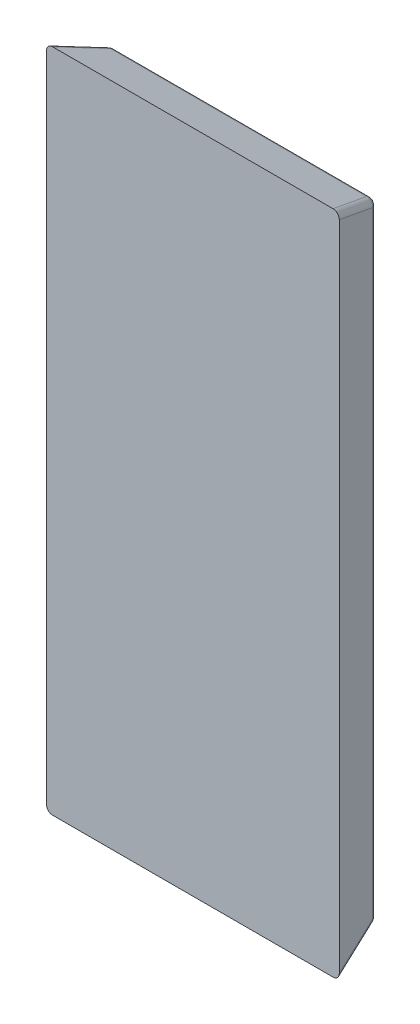
ISO-10303-21;
HEADER;
FILE_DESCRIPTION(('STEP AP214'),'2;1');
FILE_NAME('part.step','',(''),(''),'','','');
FILE_SCHEMA(('AUTOMOTIVE_DESIGN { 1 0 10303 214 1 1 1 1 }'));
ENDSEC;
DATA;
#1=APPLICATION_CONTEXT('core data for automotive mechanical design processes');
#2=APPLICATION_PROTOCOL_DEFINITION('international standard','automotive_design',2000,#1);
#3=PRODUCT_CONTEXT('',#1,'mechanical');
#4=PRODUCT('Part','Part','',(#3));
#5=PRODUCT_RELATED_PRODUCT_CATEGORY('part','',(#4));
#6=PRODUCT_DEFINITION_FORMATION('','',#4);
#7=PRODUCT_DEFINITION_CONTEXT('part definition',#1,'design');
#8=PRODUCT_DEFINITION('design','',#6,#7);
#9=PRODUCT_DEFINITION_SHAPE('','',#8);
#10=(LENGTH_UNIT() NAMED_UNIT(*) SI_UNIT(.MILLI.,.METRE.));
#11=(NAMED_UNIT(*) PLANE_ANGLE_UNIT() SI_UNIT($,.RADIAN.));
#12=(NAMED_UNIT(*) SI_UNIT($,.STERADIAN.) SOLID_ANGLE_UNIT());
#13=UNCERTAINTY_MEASURE_WITH_UNIT(LENGTH_MEASURE(1.E-05),#10,'distance_accuracy_value','');
#14=(GEOMETRIC_REPRESENTATION_CONTEXT(3) GLOBAL_UNCERTAINTY_ASSIGNED_CONTEXT((#13)) GLOBAL_UNIT_ASSIGNED_CONTEXT((#10,
#11,#12)) REPRESENTATION_CONTEXT('',''));
#15=CARTESIAN_POINT('',(0.,0.,0.));
#16=DIRECTION('',(0.,0.,1.));
#17=DIRECTION('',(1.,0.,0.));
#18=AXIS2_PLACEMENT_3D('',#15,#16,#17);
#19=CARTESIAN_POINT('',(-1.923172168692,-4.632296703857,0.200000000000009));
#20=DIRECTION('',(0.,0.,1.));
#21=DIRECTION('',(-1.,0.,0.));
#22=AXIS2_PLACEMENT_3D('',#19,#20,#21);
#23=SPHERICAL_SURFACE('',#22,0.100000000000008);
#24=CARTESIAN_POINT('',(-1.9231722324908,-4.63229670385688,0.200000000000622));
#25=DIRECTION('',(1.,0.,0.));
#26=DIRECTION('',(0.,0.,-1.));
#27=AXIS2_PLACEMENT_3D('',#24,#25,#26);
#28=CIRCLE('',#27,0.100000000000636);
#29=CARTESIAN_POINT('',(-1.92317220059149,-4.72514437001206,0.162860925031168));
#30=VERTEX_POINT('',#29);
#31=CARTESIAN_POINT('',(-1.92317220059121,-4.63229670385694,0.1));
#32=VERTEX_POINT('',#31);
#33=EDGE_CURVE('E80',#30,#32,#28,.T.);
#34=ORIENTED_EDGE('',*,*,#33,.F.);
#35=CARTESIAN_POINT('',(-1.92317216869121,-4.63229670385448,0.200000000001085));
#36=DIRECTION('',(0.240336707249159,0.360505060876959,-0.90126265218899));
#37=DIRECTION('',(0.,0.928476690884775,0.371390676355315));
#38=AXIS2_PLACEMENT_3D('',#35,#36,#37);
#39=CIRCLE('',#38,0.100000000002529);
#40=CARTESIAN_POINT('',(-2.01980320110442,-4.63220947701172,0.174262329852015));
#41=VERTEX_POINT('',#40);
#42=EDGE_CURVE('E179',#41,#30,#39,.F.);
#43=ORIENTED_EDGE('',*,*,#42,.F.);
#44=CARTESIAN_POINT('',(-1.92317216869163,-4.632296703857,0.200000000000508));
#45=DIRECTION('',(0.,1.,0.));
#46=DIRECTION('',(0.,0.,1.));
#47=AXIS2_PLACEMENT_3D('',#44,#45,#46);
#48=CIRCLE('',#47,0.100000000000493);
#49=EDGE_CURVE('E87',#32,#41,#48,.T.);
#50=ORIENTED_EDGE('',*,*,#49,.F.);
#51=EDGE_LOOP('',(#34,#43,#50));
#52=FACE_BOUND('',#51,.T.);
#53=ADVANCED_FACE('F16',(#52),#23,.T.);
#54=CARTESIAN_POINT('',(1.92317216869199,-4.632296703857,0.200000000000003));
#55=DIRECTION('',(0.,0.,1.));
#56=DIRECTION('',(6.87124561965915E-07,-0.999999999999764,0.));
#57=AXIS2_PLACEMENT_3D('',#54,#55,#56);
#58=SPHERICAL_SURFACE('',#57,0.100000000000001);
#59=CARTESIAN_POINT('',(1.92317217237602,-4.63229670938445,0.200000013819671));
#60=DIRECTION('',(-0.240336707250784,0.360505060875316,-0.901262652189214));
#61=DIRECTION('',(0.,0.928476690885391,0.371390676353776));
#62=AXIS2_PLACEMENT_3D('',#59,#60,#61);
#63=CIRCLE('',#62,0.100000000001092);
#64=CARTESIAN_POINT('',(1.92317220059099,-4.72514437294589,0.162860932364461));
#65=VERTEX_POINT('',#64);
#66=CARTESIAN_POINT('',(2.01980329503799,-4.63220949203413,0.17426235639187));
#67=VERTEX_POINT('',#66);
#68=EDGE_CURVE('E167',#65,#67,#63,.F.);
#69=ORIENTED_EDGE('',*,*,#68,.F.);
#70=CARTESIAN_POINT('',(1.9231722324908,-4.63229670385688,0.200000000000622));
#71=DIRECTION('',(-1.,0.,0.));
#72=DIRECTION('',(0.,0.,1.));
#73=AXIS2_PLACEMENT_3D('',#70,#71,#72);
#74=CIRCLE('',#73,0.100000000000636);
#75=CARTESIAN_POINT('',(1.92317220059121,-4.63229670385694,0.1));
#76=VERTEX_POINT('',#75);
#77=EDGE_CURVE('E270',#76,#65,#74,.T.);
#78=ORIENTED_EDGE('',*,*,#77,.F.);
#79=CARTESIAN_POINT('',(1.92317216869163,-4.632296703857,0.200000000000508));
#80=DIRECTION('',(0.,1.,0.));
#81=DIRECTION('',(0.,0.,1.));
#82=AXIS2_PLACEMENT_3D('',#79,#80,#81);
#83=CIRCLE('',#82,0.100000000000493);
#84=EDGE_CURVE('E257',#67,#76,#83,.T.);
#85=ORIENTED_EDGE('',*,*,#84,.F.);
#86=EDGE_LOOP('',(#69,#78,#85));
#87=FACE_BOUND('',#86,.T.);
#88=ADVANCED_FACE('F303',(#87),#58,.T.);
#89=CARTESIAN_POINT('',(-1.9231722324908,-4.63229670385688,0.200000000000622));
#90=DIRECTION('',(1.,0.,0.));
#91=DIRECTION('',(0.,0.,-1.));
#92=AXIS2_PLACEMENT_3D('',#89,#90,#91);
#93=CYLINDRICAL_SURFACE('',#92,0.100000000000636);
#94=DIRECTION('',(-1.,0.,0.));
#95=VECTOR('',#94,1.);
#96=CARTESIAN_POINT('',(1.923172168692,-4.632296703857,0.1));
#97=LINE('',#96,#95);
#98=EDGE_CURVE('E156',#76,#32,#97,.T.);
#99=ORIENTED_EDGE('',*,*,#98,.F.);
#100=ORIENTED_EDGE('',*,*,#77,.T.);
#101=DIRECTION('',(1.,0.,0.));
#102=VECTOR('',#101,1.);
#103=CARTESIAN_POINT('',(1.80411241501588E-13,-4.7251443729458,0.162860932364499));
#104=LINE('',#103,#102);
#105=EDGE_CURVE('E178',#30,#65,#104,.T.);
#106=ORIENTED_EDGE('',*,*,#105,.F.);
#107=ORIENTED_EDGE('',*,*,#33,.T.);
#108=EDGE_LOOP('',(#99,#100,#106,#107));
#109=FACE_BOUND('',#108,.T.);
#110=ADVANCED_FACE('F276',(#109),#93,.T.);
#111=CARTESIAN_POINT('',(-1.92317216869163,4.632296703857,0.200000000000508));
#112=DIRECTION('',(0.,-1.,0.));
#113=DIRECTION('',(0.,0.,-1.));
#114=AXIS2_PLACEMENT_3D('',#111,#112,#113);
#115=CYLINDRICAL_SURFACE('',#114,0.100000000000493);
#116=CARTESIAN_POINT('',(-1.92317216869163,4.632296703857,0.200000000000508));
#117=DIRECTION('',(0.,-1.,0.));
#118=DIRECTION('',(0.,0.,-1.));
#119=AXIS2_PLACEMENT_3D('',#116,#117,#118);
#120=CIRCLE('',#119,0.100000000000493);
#121=CARTESIAN_POINT('',(-2.01980331244741,4.63220934691953,0.174262421676189));
#122=VERTEX_POINT('',#121);
#123=CARTESIAN_POINT('',(-1.92317220059121,4.63229670385694,0.0999999999999832));
#124=VERTEX_POINT('',#123);
#125=EDGE_CURVE('E252',#122,#124,#120,.T.);
#126=ORIENTED_EDGE('',*,*,#125,.T.);
#127=DIRECTION('',(0.,1.,0.));
#128=VECTOR('',#127,1.);
#129=CARTESIAN_POINT('',(-1.923172168692,-4.632296703857,0.1));
#130=LINE('',#129,#128);
#131=EDGE_CURVE('E153',#32,#124,#130,.T.);
#132=ORIENTED_EDGE('',*,*,#131,.F.);
#133=ORIENTED_EDGE('',*,*,#49,.T.);
#134=DIRECTION('',(0.,-1.,0.));
#135=VECTOR('',#134,1.);
#136=CARTESIAN_POINT('',(-2.0197956626518,-2.43196683247411E-05,0.174233734944249));
#137=LINE('',#136,#135);
#138=EDGE_CURVE('E186',#122,#41,#137,.T.);
#139=ORIENTED_EDGE('',*,*,#138,.F.);
#140=EDGE_LOOP('',(#126,#132,#133,#139));
#141=FACE_BOUND('',#140,.T.);
#142=ADVANCED_FACE('F251',(#141),#115,.T.);
#143=CARTESIAN_POINT('',(1.92317216869163,-4.632296703857,0.200000000000508));
#144=DIRECTION('',(0.,1.,0.));
#145=DIRECTION('',(0.,0.,1.));
#146=AXIS2_PLACEMENT_3D('',#143,#144,#145);
#147=CYLINDRICAL_SURFACE('',#146,0.100000000000493);
#148=DIRECTION('',(0.,-1.,0.));
#149=VECTOR('',#148,1.);
#150=CARTESIAN_POINT('',(1.923172168692,4.632296703857,0.1));
#151=LINE('',#150,#149);
#152=CARTESIAN_POINT('',(1.92317218325048,4.63229670385768,0.0999999999999832));
#153=VERTEX_POINT('',#152);
#154=EDGE_CURVE('E148',#153,#76,#151,.T.);
#155=ORIENTED_EDGE('',*,*,#154,.F.);
#156=CARTESIAN_POINT('',(1.92317216869163,4.63229670385847,0.200000000000508));
#157=DIRECTION('',(0.,1.,0.));
#158=DIRECTION('',(0.,0.,1.));
#159=AXIS2_PLACEMENT_3D('',#156,#157,#158);
#160=CIRCLE('',#159,0.100000000000493);
#161=CARTESIAN_POINT('',(2.01980520425165,4.63215335761909,0.174269515943684));
#162=VERTEX_POINT('',#161);
#163=EDGE_CURVE('E113',#162,#153,#160,.T.);
#164=ORIENTED_EDGE('',*,*,#163,.F.);
#165=DIRECTION('',(0.,1.,0.));
#166=VECTOR('',#165,1.);
#167=CARTESIAN_POINT('',(2.0197956626518,-2.43196682553522E-05,0.174233734944249));
#168=LINE('',#167,#166);
#169=EDGE_CURVE('E108',#67,#162,#168,.T.);
#170=ORIENTED_EDGE('',*,*,#169,.F.);
#171=ORIENTED_EDGE('',*,*,#84,.T.);
#172=EDGE_LOOP('',(#155,#164,#170,#171));
#173=FACE_BOUND('',#172,.T.);
#174=ADVANCED_FACE('F283',(#173),#147,.T.);
#175=CARTESIAN_POINT('',(-2.0172190361462,-4.91297629059315,0.164571385548237));
#176=DIRECTION('',(-0.966234939601249,0.,-0.257662650560324));
#177=DIRECTION('',(-0.257662650560324,0.,0.966234939601249));
#178=AXIS2_PLACEMENT_3D('',#175,#176,#177);
#179=PLANE('',#178);
#180=ORIENTED_EDGE('',*,*,#138,.T.);
#181=CARTESIAN_POINT('',(-2.19999927514748,-4.90297628862446,0.849999634376815));
#182=CARTESIAN_POINT('',(-2.19249163633387,-4.89169002007219,0.821845677564466));
#183=CARTESIAN_POINT('',(-2.1849839898333,-4.88040375149407,0.793691722812313));
#184=CARTESIAN_POINT('',(-2.16996868145717,-4.8578312142964,0.737383817424575));
#185=CARTESIAN_POINT('',(-2.16246101958162,-4.84654494567685,0.709229866788989));
#186=CARTESIAN_POINT('',(-2.1474456804545,-4.82397240840657,0.652921969630561));
#187=CARTESIAN_POINT('',(-2.13993800320292,-4.81268613975585,0.624768023107719));
#188=CARTESIAN_POINT('',(-2.12492263332271,-4.79011360243348,0.568460134170951));
#189=CARTESIAN_POINT('',(-2.11741494069407,-4.77882733376184,0.540306191757026));
#190=CARTESIAN_POINT('',(-2.10239954005869,-4.7562547964079,0.483998311034265));
#191=CARTESIAN_POINT('',(-2.09489183205195,-4.7449685277256,0.455844372725428));
#192=CARTESIAN_POINT('',(-2.07987640065935,-4.7223959903606,0.399536500209015));
#193=CARTESIAN_POINT('',(-2.07236867727349,-4.7111097216779,0.371382566001438));
#194=CARTESIAN_POINT('',(-2.05735321512162,-4.68853718432237,0.31507470168371));
#195=CARTESIAN_POINT('',(-2.04984547635562,-4.67725091564953,0.28692077157356));
#196=CARTESIAN_POINT('',(-2.03482998344246,-4.65467837832398,0.230612915446852));
#197=CARTESIAN_POINT('',(-2.0273222292953,-4.64339210967127,0.202458989430294));
#198=CARTESIAN_POINT('',(-2.01981446745706,-4.63210584103374,0.174305065458615));
#199=B_SPLINE_CURVE_WITH_KNOTS('',3,(#181,#182,#183,#184,#185,#186,#187,#188,#189,#190,#191,
#192,#193,#194,#195,#196,#197,#198),.UNSPECIFIED.,.F.,.F.,(4,2,2,2,2,2,2,2,4),(0.,
0.093741709197296,0.187483418394592,0.281225127591888,0.374966836789184,0.46870854598648,
0.562450255183776,0.656191964381072,0.749933673578368),.UNSPECIFIED.);
#200=CARTESIAN_POINT('',(-2.19999932494862,-4.9029760487957,0.849999817188407));
#201=VERTEX_POINT('',#200);
#202=EDGE_CURVE('E181',#201,#41,#199,.T.);
#203=ORIENTED_EDGE('',*,*,#202,.F.);
#204=DIRECTION('',(0.,-1.,0.));
#205=VECTOR('',#204,1.);
#206=CARTESIAN_POINT('',(-2.2,4.90292735235875,0.85));
#207=LINE('',#206,#205);
#208=CARTESIAN_POINT('',(-2.19998362372716,4.90292757220578,0.849939180458669));
#209=VERTEX_POINT('',#208);
#210=EDGE_CURVE('E145',#209,#201,#207,.T.);
#211=ORIENTED_EDGE('',*,*,#210,.F.);
#212=DIRECTION('',(0.240268135658457,-0.361192879559917,-0.901005508719244));
#213=VECTOR('',#212,1.);
#214=CARTESIAN_POINT('',(-2.19996756244836,4.9029276512565,0.849878359181364));
#215=LINE('',#214,#213);
#216=EDGE_CURVE('E187',#209,#122,#215,.T.);
#217=ORIENTED_EDGE('',*,*,#216,.T.);
#218=EDGE_LOOP('',(#180,#203,#211,#217));
#219=FACE_BOUND('',#218,.T.);
#220=ADVANCED_FACE('F205',(#219),#179,.T.);
#221=CARTESIAN_POINT('',(-2.10932798008586,-4.91153042094894,0.898084292734587));
#222=DIRECTION('',(0.240336707249159,0.360505060876959,-0.90126265218899));
#223=DIRECTION('',(0.,0.928476690884775,0.371390676355315));
#224=AXIS2_PLACEMENT_3D('',#221,#222,#223);
#225=CYLINDRICAL_SURFACE('',#224,0.100000000002529);
#226=ORIENTED_EDGE('',*,*,#42,.T.);
#227=DIRECTION('',(0.240336628404011,0.360505068125909,-0.901262670314779));
#228=VECTOR('',#227,1.);
#229=CARTESIAN_POINT('',(-2.106409253394,-5.,0.85));
#230=LINE('',#229,#228);
#231=CARTESIAN_POINT('',(-2.10640925339352,-5.00000000000025,0.85));
#232=VERTEX_POINT('',#231);
#233=EDGE_CURVE('E175',#232,#30,#230,.T.);
#234=ORIENTED_EDGE('',*,*,#233,.F.);
#235=CARTESIAN_POINT('',(-2.09650550202337,-4.89229670385503,0.85));
#236=DIRECTION('',(0.,0.,1.));
#237=DIRECTION('',(0.554700196221799,0.832050294340131,0.));
#238=AXIS2_PLACEMENT_3D('',#235,#236,#237);
#239=ELLIPSE('',#238,0.110955446516783,0.100000000002529);
#240=EDGE_CURVE('E142',#201,#232,#239,.T.);
#241=ORIENTED_EDGE('',*,*,#240,.F.);
#242=ORIENTED_EDGE('',*,*,#202,.T.);
#243=EDGE_LOOP('',(#226,#234,#241,#242));
#244=FACE_BOUND('',#243,.T.);
#245=ADVANCED_FACE('F194',(#244),#225,.T.);
#246=CARTESIAN_POINT('',(-2.116409253394,-5.00371390676354,0.859284766908853));
#247=DIRECTION('',(0.,-0.92847669088526,-0.371390676354101));
#248=DIRECTION('',(0.,0.371390676354101,-0.92847669088526));
#249=AXIS2_PLACEMENT_3D('',#246,#247,#248);
#250=PLANE('',#249);
#251=ORIENTED_EDGE('',*,*,#105,.T.);
#252=DIRECTION('',(-0.240336707250789,0.360505060875328,-0.901262652189208));
#253=VECTOR('',#252,1.);
#254=CARTESIAN_POINT('',(2.01625007437538,-4.86476123147252,0.511903078680536));
#255=LINE('',#254,#253);
#256=CARTESIAN_POINT('',(2.10640925339396,-5.00000000000012,0.849999999999985));
#257=VERTEX_POINT('',#256);
#258=EDGE_CURVE('E172',#257,#65,#255,.T.);
#259=ORIENTED_EDGE('',*,*,#258,.F.);
#260=DIRECTION('',(1.,0.,0.));
#261=VECTOR('',#260,1.);
#262=CARTESIAN_POINT('',(-2.106409253394,-5.,0.85));
#263=LINE('',#262,#261);
#264=EDGE_CURVE('E140',#232,#257,#263,.T.);
#265=ORIENTED_EDGE('',*,*,#264,.F.);
#266=ORIENTED_EDGE('',*,*,#233,.T.);
#267=EDGE_LOOP('',(#251,#259,#265,#266));
#268=FACE_BOUND('',#267,.T.);
#269=ADVANCED_FACE('F204',(#268),#250,.T.);
#270=CARTESIAN_POINT('',(2.10932798005963,-4.91153042090921,0.898084292632271));
#271=DIRECTION('',(-0.240336707250784,0.360505060875316,-0.901262652189214));
#272=DIRECTION('',(0.,0.928476690885391,0.371390676353776));
#273=AXIS2_PLACEMENT_3D('',#270,#271,#272);
#274=CYLINDRICAL_SURFACE('',#273,0.100000000001092);
#275=ORIENTED_EDGE('',*,*,#68,.T.);
#276=DIRECTION('',(-0.240268169326953,0.361192542212018,-0.901005634976105));
#277=VECTOR('',#276,1.);
#278=CARTESIAN_POINT('',(2.19999992626895,-4.90297638923073,0.849999723508572));
#279=LINE('',#278,#277);
#280=CARTESIAN_POINT('',(2.2,-4.90297607526895,0.85));
#281=VERTEX_POINT('',#280);
#282=EDGE_CURVE('E165',#281,#67,#279,.T.);
#283=ORIENTED_EDGE('',*,*,#282,.F.);
#284=CARTESIAN_POINT('',(2.09650550202434,-4.89229670385632,0.85));
#285=DIRECTION('',(0.,0.,1.));
#286=DIRECTION('',(-0.554700196226145,0.832050294337234,0.));
#287=AXIS2_PLACEMENT_3D('',#284,#285,#286);
#288=ELLIPSE('',#287,0.110955446515161,0.100000000001092);
#289=EDGE_CURVE('E121',#257,#281,#288,.T.);
#290=ORIENTED_EDGE('',*,*,#289,.F.);
#291=ORIENTED_EDGE('',*,*,#258,.T.);
#292=EDGE_LOOP('',(#275,#283,#290,#291));
#293=FACE_BOUND('',#292,.T.);
#294=ADVANCED_FACE('F210',(#293),#274,.T.);
#295=CARTESIAN_POINT('',(2.2025766265056,-4.91297629059302,0.859662349396012));
#296=DIRECTION('',(0.966234939601249,0.,-0.257662650560324));
#297=DIRECTION('',(-0.257662650560324,0.,-0.966234939601249));
#298=AXIS2_PLACEMENT_3D('',#295,#296,#297);
#299=PLANE('',#298);
#300=ORIENTED_EDGE('',*,*,#169,.T.);
#301=DIRECTION('',(0.240268135658521,0.36119287955928,0.901005508719483));
#302=VECTOR('',#301,1.);
#303=CARTESIAN_POINT('',(2.0198147458515,4.6321055782047,0.174305296943118));
#304=LINE('',#303,#302);
#305=CARTESIAN_POINT('',(2.19998333129169,4.90292756588825,0.849939258813812));
#306=VERTEX_POINT('',#305);
#307=EDGE_CURVE('E101',#162,#306,#304,.T.);
#308=ORIENTED_EDGE('',*,*,#307,.T.);
#309=DIRECTION('',(0.,1.,0.));
#310=VECTOR('',#309,1.);
#311=CARTESIAN_POINT('',(2.2,-4.90297565046808,0.85));
#312=LINE('',#311,#310);
#313=EDGE_CURVE('E105',#281,#306,#312,.T.);
#314=ORIENTED_EDGE('',*,*,#313,.F.);
#315=ORIENTED_EDGE('',*,*,#282,.T.);
#316=EDGE_LOOP('',(#300,#308,#314,#315));
#317=FACE_BOUND('',#316,.T.);
#318=ADVANCED_FACE('F103',(#317),#299,.T.);
#319=CARTESIAN_POINT('',(1.923172168692,4.63229670385701,0.200000000000006));
#320=DIRECTION('',(0.,-0.928476690885267,0.371390676354085));
#321=DIRECTION('',(0.,-0.371390676354085,-0.928476690885267));
#322=AXIS2_PLACEMENT_3D('',#319,#320,#321);
#323=SPHERICAL_SURFACE('',#322,0.100000000000003);
#324=CARTESIAN_POINT('',(1.92317216970724,4.6322967053785,0.200000003810995));
#325=DIRECTION('',(0.24033670724914,0.360505060876919,0.901262652189011));
#326=DIRECTION('',(0.,-0.928476690884792,0.371390676355271));
#327=AXIS2_PLACEMENT_3D('',#324,#325,#326);
#328=CIRCLE('',#327,0.100000000002506);
#329=CARTESIAN_POINT('',(1.92317220109924,4.72514437370751,0.16286093426941));
#330=VERTEX_POINT('',#329);
#331=EDGE_CURVE('E127',#162,#330,#328,.T.);
#332=ORIENTED_EDGE('',*,*,#331,.F.);
#333=ORIENTED_EDGE('',*,*,#163,.T.);
#334=CARTESIAN_POINT('',(1.92317219780933,4.63229670385688,0.200000000000622));
#335=DIRECTION('',(-1.,0.,0.));
#336=DIRECTION('',(0.,0.,1.));
#337=AXIS2_PLACEMENT_3D('',#334,#335,#336);
#338=CIRCLE('',#337,0.100000000000636);
#339=EDGE_CURVE('E129',#330,#153,#338,.T.);
#340=ORIENTED_EDGE('',*,*,#339,.F.);
#341=EDGE_LOOP('',(#332,#333,#340));
#342=FACE_BOUND('',#341,.T.);
#343=ADVANCED_FACE('F217',(#342),#323,.T.);
#344=CARTESIAN_POINT('',(-1.33399676856575,-6.01941281271311,0.1));
#345=DIRECTION('',(0.,0.,-1.));
#346=DIRECTION('',(-0.391555164096889,0.92015463562874,0.));
#347=AXIS2_PLACEMENT_3D('',#344,#345,#346);
#348=PLANE('',#347);
#349=DIRECTION('',(-1.,0.,0.));
#350=VECTOR('',#349,1.);
#351=CARTESIAN_POINT('',(-1.73407350761642E-08,4.632296703857,0.0999999999999664));
#352=LINE('',#351,#350);
#353=EDGE_CURVE('E280',#153,#124,#352,.T.);
#354=ORIENTED_EDGE('',*,*,#353,.F.);
#355=ORIENTED_EDGE('',*,*,#154,.T.);
#356=ORIENTED_EDGE('',*,*,#98,.T.);
#357=ORIENTED_EDGE('',*,*,#131,.T.);
#358=EDGE_LOOP('',(#354,#355,#356,#357));
#359=FACE_BOUND('',#358,.T.);
#360=ADVANCED_FACE('F220',(#359),#348,.T.);
#361=CARTESIAN_POINT('',(-1.92317216869199,4.632296703857,0.200000000000002));
#362=DIRECTION('',(0.,0.,1.));
#363=DIRECTION('',(-6.87124561965915E-07,0.999999999999764,0.));
#364=AXIS2_PLACEMENT_3D('',#361,#362,#363);
#365=SPHERICAL_SURFACE('',#364,0.1);
#366=CARTESIAN_POINT('',(-1.92317217237631,4.63229670938212,0.200000013820034));
#367=DIRECTION('',(-0.240336707249095,0.360505060876906,0.901262652189028));
#368=DIRECTION('',(0.,-0.928476690884799,0.371390676355253));
#369=AXIS2_PLACEMENT_3D('',#366,#367,#368);
#370=CIRCLE('',#369,0.100000000002507);
#371=CARTESIAN_POINT('',(-1.92317223249035,4.72514437294561,0.162860932364681));
#372=VERTEX_POINT('',#371);
#373=EDGE_CURVE('E35',#372,#122,#370,.T.);
#374=ORIENTED_EDGE('',*,*,#373,.F.);
#375=CARTESIAN_POINT('',(-1.9231722324908,4.63229670385688,0.200000000000622));
#376=DIRECTION('',(1.,0.,0.));
#377=DIRECTION('',(0.,0.,-1.));
#378=AXIS2_PLACEMENT_3D('',#375,#376,#377);
#379=CIRCLE('',#378,0.100000000000636);
#380=EDGE_CURVE('E285',#124,#372,#379,.T.);
#381=ORIENTED_EDGE('',*,*,#380,.F.);
#382=ORIENTED_EDGE('',*,*,#125,.F.);
#383=EDGE_LOOP('',(#374,#381,#382));
#384=FACE_BOUND('',#383,.T.);
#385=ADVANCED_FACE('F224',(#384),#365,.T.);
#386=CARTESIAN_POINT('',(-5.88732580889751,3.37854422406656,0.85));
#387=DIRECTION('',(0.,0.,1.));
#388=DIRECTION('',(0.402738614265917,-0.91531503242281,0.));
#389=AXIS2_PLACEMENT_3D('',#386,#387,#388);
#390=PLANE('',#389);
#391=ORIENTED_EDGE('',*,*,#313,.T.);
#392=CARTESIAN_POINT('',(2.09650550202339,4.89229670385505,0.85));
#393=DIRECTION('',(0.,0.,1.));
#394=DIRECTION('',(-0.554700196221796,-0.832050294340133,0.));
#395=AXIS2_PLACEMENT_3D('',#392,#393,#394);
#396=ELLIPSE('',#395,0.110955446516755,0.100000000002507);
#397=CARTESIAN_POINT('',(2.10640925339353,5.00000000000025,0.85));
#398=VERTEX_POINT('',#397);
#399=EDGE_CURVE('E117',#398,#306,#396,.F.);
#400=ORIENTED_EDGE('',*,*,#399,.F.);
#401=DIRECTION('',(1.,0.,0.));
#402=VECTOR('',#401,1.);
#403=CARTESIAN_POINT('',(-1.79977560632594E-13,5.,0.85));
#404=LINE('',#403,#402);
#405=CARTESIAN_POINT('',(-2.1064092533937,5.00000000000024,0.85));
#406=VERTEX_POINT('',#405);
#407=EDGE_CURVE('E248',#406,#398,#404,.T.);
#408=ORIENTED_EDGE('',*,*,#407,.F.);
#409=CARTESIAN_POINT('',(-2.09650550202336,4.89229670385504,0.85));
#410=DIRECTION('',(0.,0.,1.));
#411=DIRECTION('',(-0.554700196221753,0.832050294340161,0.));
#412=AXIS2_PLACEMENT_3D('',#409,#410,#411);
#413=ELLIPSE('',#412,0.110955446516753,0.100000000002507);
#414=EDGE_CURVE('E249',#209,#406,#413,.F.);
#415=ORIENTED_EDGE('',*,*,#414,.F.);
#416=ORIENTED_EDGE('',*,*,#210,.T.);
#417=ORIENTED_EDGE('',*,*,#240,.T.);
#418=ORIENTED_EDGE('',*,*,#264,.T.);
#419=ORIENTED_EDGE('',*,*,#289,.T.);
#420=EDGE_LOOP('',(#391,#400,#408,#415,#416,#417,#418,#419));
#421=FACE_BOUND('',#420,.T.);
#422=ADVANCED_FACE('F116',(#421),#390,.T.);
#423=CARTESIAN_POINT('',(2.10932887336842,4.91153176087277,0.898087642544111));
#424=DIRECTION('',(-0.240336707249127,-0.360505060876914,-0.901262652189017));
#425=DIRECTION('',(0.,0.928476690884795,-0.371390676355264));
#426=AXIS2_PLACEMENT_3D('',#423,#424,#425);
#427=CYLINDRICAL_SURFACE('',#426,0.100000000002507);
#428=ORIENTED_EDGE('',*,*,#331,.T.);
#429=DIRECTION('',(-0.240336628404009,-0.360505068125909,-0.90126267031478));
#430=VECTOR('',#429,1.);
#431=CARTESIAN_POINT('',(2.106409253394,5.,0.85));
#432=LINE('',#431,#430);
#433=EDGE_CURVE('E125',#398,#330,#432,.T.);
#434=ORIENTED_EDGE('',*,*,#433,.F.);
#435=ORIENTED_EDGE('',*,*,#399,.T.);
#436=ORIENTED_EDGE('',*,*,#307,.F.);
#437=EDGE_LOOP('',(#428,#434,#435,#436));
#438=FACE_BOUND('',#437,.T.);
#439=ADVANCED_FACE('F123',(#438),#427,.T.);
#440=CARTESIAN_POINT('',(1.92317219780933,4.63229670385688,0.200000000000622));
#441=DIRECTION('',(-1.,0.,0.));
#442=DIRECTION('',(0.,0.,1.));
#443=AXIS2_PLACEMENT_3D('',#440,#441,#442);
#444=CYLINDRICAL_SURFACE('',#443,0.100000000000636);
#445=ORIENTED_EDGE('',*,*,#353,.T.);
#446=ORIENTED_EDGE('',*,*,#380,.T.);
#447=DIRECTION('',(-1.,0.,0.));
#448=VECTOR('',#447,1.);
#449=CARTESIAN_POINT('',(-1.79977560632594E-13,4.7251443729458,0.162860932364499));
#450=LINE('',#449,#448);
#451=EDGE_CURVE('E26',#330,#372,#450,.T.);
#452=ORIENTED_EDGE('',*,*,#451,.F.);
#453=ORIENTED_EDGE('',*,*,#339,.T.);
#454=EDGE_LOOP('',(#445,#446,#452,#453));
#455=FACE_BOUND('',#454,.T.);
#456=ADVANCED_FACE('F232',(#455),#444,.T.);
#457=CARTESIAN_POINT('',(-1.92317216869125,4.63229670385452,0.200000000001044));
#458=DIRECTION('',(-0.240336707249095,0.360505060876906,0.901262652189028));
#459=DIRECTION('',(0.,-0.928476690884799,0.371390676355253));
#460=AXIS2_PLACEMENT_3D('',#457,#458,#459);
#461=CYLINDRICAL_SURFACE('',#460,0.100000000002507);
#462=ORIENTED_EDGE('',*,*,#373,.T.);
#463=ORIENTED_EDGE('',*,*,#216,.F.);
#464=ORIENTED_EDGE('',*,*,#414,.T.);
#465=DIRECTION('',(-0.240336628404482,0.360505068125866,0.901262670314671));
#466=VECTOR('',#465,1.);
#467=CARTESIAN_POINT('',(-1.92317223249041,4.72514437294596,0.162860932364904));
#468=LINE('',#467,#466);
#469=EDGE_CURVE('E11',#372,#406,#468,.T.);
#470=ORIENTED_EDGE('',*,*,#469,.F.);
#471=EDGE_LOOP('',(#462,#463,#464,#470));
#472=FACE_BOUND('',#471,.T.);
#473=ADVANCED_FACE('F234',(#472),#461,.T.);
#474=CARTESIAN_POINT('',(-2.11640925339436,4.72143046065462,0.153576151636548));
#475=DIRECTION('',(0.,0.928476690885261,-0.371390676354101));
#476=DIRECTION('',(0.,0.371390676354101,0.928476690885261));
#477=AXIS2_PLACEMENT_3D('',#474,#475,#476);
#478=PLANE('',#477);
#479=ORIENTED_EDGE('',*,*,#451,.T.);
#480=ORIENTED_EDGE('',*,*,#469,.T.);
#481=ORIENTED_EDGE('',*,*,#407,.T.);
#482=ORIENTED_EDGE('',*,*,#433,.T.);
#483=EDGE_LOOP('',(#479,#480,#481,#482));
#484=FACE_BOUND('',#483,.T.);
#485=ADVANCED_FACE('F18',(#484),#478,.T.);
#486=CLOSED_SHELL('',(#53,#88,#110,#142,#174,#220,#245,#269,#294,#318,#343,#360,#385,#422,#439,
#456,#473,#485));
#487=MANIFOLD_SOLID_BREP('B1',#486);
#488=ADVANCED_BREP_SHAPE_REPRESENTATION('',(#18,#487),#14);
#489=SHAPE_DEFINITION_REPRESENTATION(#9,#488);
ENDSEC;
END-ISO-10303-21;
